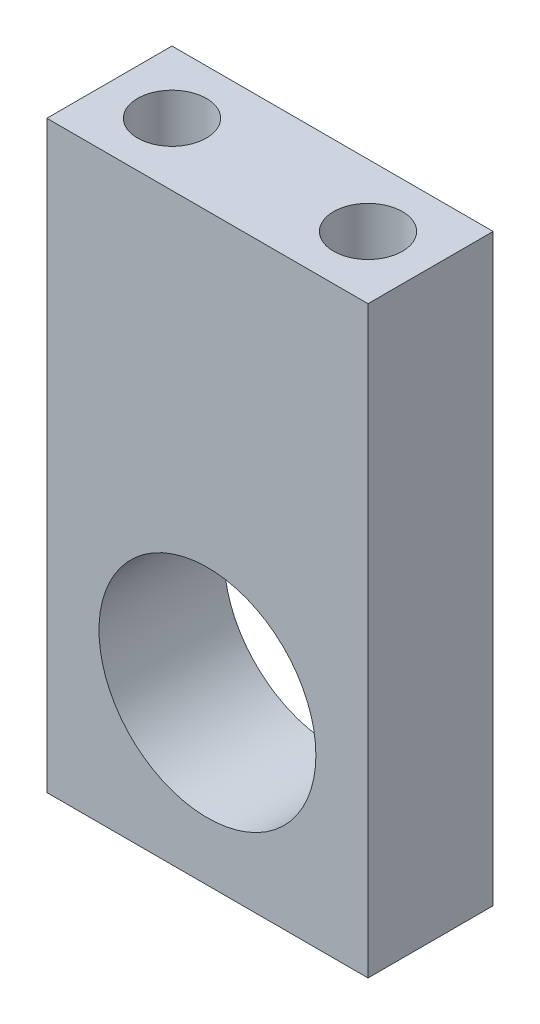
ISO-10303-21;
HEADER;
FILE_DESCRIPTION(('STEP AP214'),'2;1');
FILE_NAME('part.step','',(''),(''),'','','');
FILE_SCHEMA(('AUTOMOTIVE_DESIGN { 1 0 10303 214 1 1 1 1 }'));
ENDSEC;
DATA;
#1=APPLICATION_CONTEXT('core data for automotive mechanical design processes');
#2=APPLICATION_PROTOCOL_DEFINITION('international standard','automotive_design',2000,#1);
#3=PRODUCT_CONTEXT('',#1,'mechanical');
#4=PRODUCT('Part','Part','',(#3));
#5=PRODUCT_RELATED_PRODUCT_CATEGORY('part','',(#4));
#6=PRODUCT_DEFINITION_FORMATION('','',#4);
#7=PRODUCT_DEFINITION_CONTEXT('part definition',#1,'design');
#8=PRODUCT_DEFINITION('design','',#6,#7);
#9=PRODUCT_DEFINITION_SHAPE('','',#8);
#10=(LENGTH_UNIT() NAMED_UNIT(*) SI_UNIT(.MILLI.,.METRE.));
#11=(NAMED_UNIT(*) PLANE_ANGLE_UNIT() SI_UNIT($,.RADIAN.));
#12=(NAMED_UNIT(*) SI_UNIT($,.STERADIAN.) SOLID_ANGLE_UNIT());
#13=UNCERTAINTY_MEASURE_WITH_UNIT(LENGTH_MEASURE(1.E-05),#10,'distance_accuracy_value','');
#14=(GEOMETRIC_REPRESENTATION_CONTEXT(3) GLOBAL_UNCERTAINTY_ASSIGNED_CONTEXT((#13)) GLOBAL_UNIT_ASSIGNED_CONTEXT((#10,
#11,#12)) REPRESENTATION_CONTEXT('',''));
#15=CARTESIAN_POINT('',(0.,0.,0.));
#16=DIRECTION('',(0.,0.,1.));
#17=DIRECTION('',(1.,0.,0.));
#18=AXIS2_PLACEMENT_3D('',#15,#16,#17);
#19=CARTESIAN_POINT('',(7.7,28.,-3.));
#20=DIRECTION('',(-1.,0.,0.));
#21=DIRECTION('',(0.,0.,1.));
#22=AXIS2_PLACEMENT_3D('',#19,#20,#21);
#23=PLANE('',#22);
#24=DIRECTION('',(0.,0.,-1.));
#25=VECTOR('',#24,1.);
#26=CARTESIAN_POINT('',(7.7,0.,-3.));
#27=LINE('',#26,#25);
#28=CARTESIAN_POINT('',(7.7,0.,3.));
#29=VERTEX_POINT('',#28);
#30=CARTESIAN_POINT('',(7.7,0.,-3.));
#31=VERTEX_POINT('',#30);
#32=EDGE_CURVE('E109',#29,#31,#27,.T.);
#33=ORIENTED_EDGE('',*,*,#32,.T.);
#34=DIRECTION('',(0.,-1.,0.));
#35=VECTOR('',#34,1.);
#36=CARTESIAN_POINT('',(7.7,28.,-3.));
#37=LINE('',#36,#35);
#38=CARTESIAN_POINT('',(7.7,28.,-3.));
#39=VERTEX_POINT('',#38);
#40=EDGE_CURVE('E11',#39,#31,#37,.T.);
#41=ORIENTED_EDGE('',*,*,#40,.F.);
#42=DIRECTION('',(0.,0.,-1.));
#43=VECTOR('',#42,1.);
#44=CARTESIAN_POINT('',(7.7,28.,-3.));
#45=LINE('',#44,#43);
#46=CARTESIAN_POINT('',(7.7,28.,3.));
#47=VERTEX_POINT('',#46);
#48=EDGE_CURVE('E110',#47,#39,#45,.T.);
#49=ORIENTED_EDGE('',*,*,#48,.F.);
#50=DIRECTION('',(0.,-1.,0.));
#51=VECTOR('',#50,1.);
#52=CARTESIAN_POINT('',(7.7,28.,3.));
#53=LINE('',#52,#51);
#54=EDGE_CURVE('E116',#47,#29,#53,.T.);
#55=ORIENTED_EDGE('',*,*,#54,.T.);
#56=EDGE_LOOP('',(#33,#41,#49,#55));
#57=FACE_BOUND('',#56,.T.);
#58=ADVANCED_FACE('F32',(#57),#23,.F.);
#59=CARTESIAN_POINT('',(-7.7,28.,-3.));
#60=DIRECTION('',(0.,0.,1.));
#61=DIRECTION('',(1.,0.,0.));
#62=AXIS2_PLACEMENT_3D('',#59,#60,#61);
#63=PLANE('',#62);
#64=CARTESIAN_POINT('',(0.,8.,-3.));
#65=DIRECTION('',(0.,0.,1.));
#66=DIRECTION('',(1.,0.,0.));
#67=AXIS2_PLACEMENT_3D('',#64,#65,#66);
#68=CIRCLE('',#67,5.2);
#69=CARTESIAN_POINT('',(5.2,8.,-3.));
#70=VERTEX_POINT('',#69);
#71=EDGE_CURVE('E103',#70,#70,#68,.F.);
#72=ORIENTED_EDGE('',*,*,#71,.F.);
#73=EDGE_LOOP('',(#72));
#74=FACE_BOUND('',#73,.T.);
#75=DIRECTION('',(-1.,0.,0.));
#76=VECTOR('',#75,1.);
#77=CARTESIAN_POINT('',(-7.7,0.,-3.));
#78=LINE('',#77,#76);
#79=CARTESIAN_POINT('',(-7.7,0.,-3.));
#80=VERTEX_POINT('',#79);
#81=EDGE_CURVE('E119',#31,#80,#78,.T.);
#82=ORIENTED_EDGE('',*,*,#81,.T.);
#83=DIRECTION('',(0.,-1.,0.));
#84=VECTOR('',#83,1.);
#85=CARTESIAN_POINT('',(-7.7,28.,-3.));
#86=LINE('',#85,#84);
#87=CARTESIAN_POINT('',(-7.7,28.,-3.));
#88=VERTEX_POINT('',#87);
#89=EDGE_CURVE('E40',#88,#80,#86,.T.);
#90=ORIENTED_EDGE('',*,*,#89,.F.);
#91=DIRECTION('',(-1.,0.,0.));
#92=VECTOR('',#91,1.);
#93=CARTESIAN_POINT('',(-7.7,28.,-3.));
#94=LINE('',#93,#92);
#95=EDGE_CURVE('E79',#39,#88,#94,.T.);
#96=ORIENTED_EDGE('',*,*,#95,.F.);
#97=ORIENTED_EDGE('',*,*,#40,.T.);
#98=EDGE_LOOP('',(#82,#90,#96,#97));
#99=FACE_BOUND('',#98,.T.);
#100=ADVANCED_FACE('F144',(#74,#99),#63,.F.);
#101=CARTESIAN_POINT('',(-7.7,28.,-3.));
#102=DIRECTION('',(1.,0.,0.));
#103=DIRECTION('',(0.,0.,-1.));
#104=AXIS2_PLACEMENT_3D('',#101,#102,#103);
#105=PLANE('',#104);
#106=DIRECTION('',(0.,0.,1.));
#107=VECTOR('',#106,1.);
#108=CARTESIAN_POINT('',(-7.7,0.,-3.));
#109=LINE('',#108,#107);
#110=CARTESIAN_POINT('',(-7.7,0.,3.));
#111=VERTEX_POINT('',#110);
#112=EDGE_CURVE('E66',#80,#111,#109,.T.);
#113=ORIENTED_EDGE('',*,*,#112,.T.);
#114=DIRECTION('',(0.,-1.,0.));
#115=VECTOR('',#114,1.);
#116=CARTESIAN_POINT('',(-7.7,28.,3.));
#117=LINE('',#116,#115);
#118=CARTESIAN_POINT('',(-7.7,28.,3.));
#119=VERTEX_POINT('',#118);
#120=EDGE_CURVE('E124',#119,#111,#117,.T.);
#121=ORIENTED_EDGE('',*,*,#120,.F.);
#122=DIRECTION('',(0.,0.,1.));
#123=VECTOR('',#122,1.);
#124=CARTESIAN_POINT('',(-7.7,28.,-3.));
#125=LINE('',#124,#123);
#126=EDGE_CURVE('E113',#88,#119,#125,.T.);
#127=ORIENTED_EDGE('',*,*,#126,.F.);
#128=ORIENTED_EDGE('',*,*,#89,.T.);
#129=EDGE_LOOP('',(#113,#121,#127,#128));
#130=FACE_BOUND('',#129,.T.);
#131=ADVANCED_FACE('F126',(#130),#105,.F.);
#132=CARTESIAN_POINT('',(-7.7,28.,3.));
#133=DIRECTION('',(0.,0.,-1.));
#134=DIRECTION('',(-1.,0.,0.));
#135=AXIS2_PLACEMENT_3D('',#132,#133,#134);
#136=PLANE('',#135);
#137=CARTESIAN_POINT('',(0.,8.,3.));
#138=DIRECTION('',(0.,0.,1.));
#139=DIRECTION('',(1.,0.,0.));
#140=AXIS2_PLACEMENT_3D('',#137,#138,#139);
#141=CIRCLE('',#140,5.2);
#142=CARTESIAN_POINT('',(5.2,8.,3.));
#143=VERTEX_POINT('',#142);
#144=EDGE_CURVE('E158',#143,#143,#141,.T.);
#145=ORIENTED_EDGE('',*,*,#144,.F.);
#146=EDGE_LOOP('',(#145));
#147=FACE_BOUND('',#146,.T.);
#148=DIRECTION('',(1.,0.,0.));
#149=VECTOR('',#148,1.);
#150=CARTESIAN_POINT('',(-7.7,0.,3.));
#151=LINE('',#150,#149);
#152=EDGE_CURVE('E72',#111,#29,#151,.T.);
#153=ORIENTED_EDGE('',*,*,#152,.T.);
#154=ORIENTED_EDGE('',*,*,#54,.F.);
#155=DIRECTION('',(1.,0.,0.));
#156=VECTOR('',#155,1.);
#157=CARTESIAN_POINT('',(-7.7,28.,3.));
#158=LINE('',#157,#156);
#159=EDGE_CURVE('E48',#119,#47,#158,.T.);
#160=ORIENTED_EDGE('',*,*,#159,.F.);
#161=ORIENTED_EDGE('',*,*,#120,.T.);
#162=EDGE_LOOP('',(#153,#154,#160,#161));
#163=FACE_BOUND('',#162,.T.);
#164=ADVANCED_FACE('F133',(#147,#163),#136,.F.);
#165=CARTESIAN_POINT('',(0.,28.,0.));
#166=DIRECTION('',(0.,1.,0.));
#167=DIRECTION('',(0.,0.,1.));
#168=AXIS2_PLACEMENT_3D('',#165,#166,#167);
#169=PLANE('',#168);
#170=CARTESIAN_POINT('',(-4.7,28.,0.));
#171=DIRECTION('',(0.,1.,0.));
#172=DIRECTION('',(0.,0.,1.));
#173=AXIS2_PLACEMENT_3D('',#170,#171,#172);
#174=CIRCLE('',#173,1.64999999999999);
#175=CARTESIAN_POINT('',(-4.7,28.,1.64999999999999));
#176=VERTEX_POINT('',#175);
#177=EDGE_CURVE('E97',#176,#176,#174,.T.);
#178=ORIENTED_EDGE('',*,*,#177,.F.);
#179=EDGE_LOOP('',(#178));
#180=FACE_BOUND('',#179,.T.);
#181=CARTESIAN_POINT('',(4.7,28.,0.));
#182=DIRECTION('',(0.,1.,0.));
#183=DIRECTION('',(0.,0.,1.));
#184=AXIS2_PLACEMENT_3D('',#181,#182,#183);
#185=CIRCLE('',#184,1.64999999999999);
#186=CARTESIAN_POINT('',(4.7,28.,1.64999999999999));
#187=VERTEX_POINT('',#186);
#188=EDGE_CURVE('E96',#187,#187,#185,.T.);
#189=ORIENTED_EDGE('',*,*,#188,.F.);
#190=EDGE_LOOP('',(#189));
#191=FACE_BOUND('',#190,.T.);
#192=ORIENTED_EDGE('',*,*,#48,.T.);
#193=ORIENTED_EDGE('',*,*,#95,.T.);
#194=ORIENTED_EDGE('',*,*,#126,.T.);
#195=ORIENTED_EDGE('',*,*,#159,.T.);
#196=EDGE_LOOP('',(#192,#193,#194,#195));
#197=FACE_BOUND('',#196,.T.);
#198=ADVANCED_FACE('F135',(#180,#191,#197),#169,.T.);
#199=CARTESIAN_POINT('',(0.,0.,0.));
#200=DIRECTION('',(0.,1.,0.));
#201=DIRECTION('',(0.,0.,1.));
#202=AXIS2_PLACEMENT_3D('',#199,#200,#201);
#203=PLANE('',#202);
#204=ORIENTED_EDGE('',*,*,#32,.F.);
#205=ORIENTED_EDGE('',*,*,#152,.F.);
#206=ORIENTED_EDGE('',*,*,#112,.F.);
#207=ORIENTED_EDGE('',*,*,#81,.F.);
#208=EDGE_LOOP('',(#204,#205,#206,#207));
#209=FACE_BOUND('',#208,.T.);
#210=ADVANCED_FACE('F129',(#209),#203,.F.);
#211=CARTESIAN_POINT('',(4.7,14.6,0.));
#212=DIRECTION('',(0.,1.,0.));
#213=DIRECTION('',(0.,0.,1.));
#214=AXIS2_PLACEMENT_3D('',#211,#212,#213);
#215=CONICAL_SURFACE('',#214,1.65,1.02974425867665);
#216=CARTESIAN_POINT('',(4.7,13.6085799786045,0.));
#217=VERTEX_POINT('',#216);
#218=VERTEX_LOOP('',#217);
#219=FACE_BOUND('',#218,.T.);
#220=CARTESIAN_POINT('',(4.7,14.6,0.));
#221=DIRECTION('',(0.,1.,0.));
#222=DIRECTION('',(0.,0.,1.));
#223=AXIS2_PLACEMENT_3D('',#220,#221,#222);
#224=CIRCLE('',#223,1.65);
#225=CARTESIAN_POINT('',(4.7,14.6,1.65));
#226=VERTEX_POINT('',#225);
#227=EDGE_CURVE('E100',#226,#226,#224,.T.);
#228=ORIENTED_EDGE('',*,*,#227,.T.);
#229=EDGE_LOOP('',(#228));
#230=FACE_BOUND('',#229,.T.);
#231=ADVANCED_FACE('F172',(#219,#230),#215,.F.);
#232=CARTESIAN_POINT('',(4.7,28.,0.));
#233=DIRECTION('',(0.,1.,0.));
#234=DIRECTION('',(0.,0.,1.));
#235=AXIS2_PLACEMENT_3D('',#232,#233,#234);
#236=CYLINDRICAL_SURFACE('',#235,1.64999999999999);
#237=ORIENTED_EDGE('',*,*,#227,.F.);
#238=EDGE_LOOP('',(#237));
#239=FACE_BOUND('',#238,.T.);
#240=ORIENTED_EDGE('',*,*,#188,.T.);
#241=EDGE_LOOP('',(#240));
#242=FACE_BOUND('',#241,.T.);
#243=ADVANCED_FACE('F90',(#239,#242),#236,.F.);
#244=CARTESIAN_POINT('',(-4.7,14.6,0.));
#245=DIRECTION('',(0.,1.,0.));
#246=DIRECTION('',(0.,0.,1.));
#247=AXIS2_PLACEMENT_3D('',#244,#245,#246);
#248=CONICAL_SURFACE('',#247,1.64999999999999,1.02974425867665);
#249=CARTESIAN_POINT('',(-4.7,13.6085799786045,0.));
#250=VERTEX_POINT('',#249);
#251=VERTEX_LOOP('',#250);
#252=FACE_BOUND('',#251,.T.);
#253=CARTESIAN_POINT('',(-4.7,14.6,0.));
#254=DIRECTION('',(0.,1.,0.));
#255=DIRECTION('',(0.,0.,1.));
#256=AXIS2_PLACEMENT_3D('',#253,#254,#255);
#257=CIRCLE('',#256,1.64999999999999);
#258=CARTESIAN_POINT('',(-4.7,14.6,1.65));
#259=VERTEX_POINT('',#258);
#260=EDGE_CURVE('E94',#259,#259,#257,.T.);
#261=ORIENTED_EDGE('',*,*,#260,.T.);
#262=EDGE_LOOP('',(#261));
#263=FACE_BOUND('',#262,.T.);
#264=ADVANCED_FACE('F86',(#252,#263),#248,.F.);
#265=CARTESIAN_POINT('',(-4.7,28.,0.));
#266=DIRECTION('',(0.,1.,0.));
#267=DIRECTION('',(0.,0.,1.));
#268=AXIS2_PLACEMENT_3D('',#265,#266,#267);
#269=CYLINDRICAL_SURFACE('',#268,1.64999999999999);
#270=ORIENTED_EDGE('',*,*,#260,.F.);
#271=EDGE_LOOP('',(#270));
#272=FACE_BOUND('',#271,.T.);
#273=ORIENTED_EDGE('',*,*,#177,.T.);
#274=EDGE_LOOP('',(#273));
#275=FACE_BOUND('',#274,.T.);
#276=ADVANCED_FACE('F89',(#272,#275),#269,.F.);
#277=CARTESIAN_POINT('',(0.,8.,-3.001));
#278=DIRECTION('',(0.,0.,1.));
#279=DIRECTION('',(1.,0.,0.));
#280=AXIS2_PLACEMENT_3D('',#277,#278,#279);
#281=CYLINDRICAL_SURFACE('',#280,5.2);
#282=CARTESIAN_POINT('',(5.2,8.,3.));
#283=CARTESIAN_POINT('',(5.2,8.,2.9375));
#284=CARTESIAN_POINT('',(5.2,8.,2.875));
#285=CARTESIAN_POINT('',(5.2,8.,2.75));
#286=CARTESIAN_POINT('',(5.2,8.,2.6875));
#287=CARTESIAN_POINT('',(5.2,8.,2.5625));
#288=CARTESIAN_POINT('',(5.2,8.,2.5));
#289=CARTESIAN_POINT('',(5.2,8.,2.375));
#290=CARTESIAN_POINT('',(5.2,8.,2.3125));
#291=CARTESIAN_POINT('',(5.2,8.,2.1875));
#292=CARTESIAN_POINT('',(5.2,8.,2.125));
#293=CARTESIAN_POINT('',(5.2,8.,2.));
#294=CARTESIAN_POINT('',(5.2,8.,1.9375));
#295=CARTESIAN_POINT('',(5.2,8.,1.8125));
#296=CARTESIAN_POINT('',(5.2,8.,1.75));
#297=CARTESIAN_POINT('',(5.2,8.,1.625));
#298=CARTESIAN_POINT('',(5.2,8.,1.5625));
#299=CARTESIAN_POINT('',(5.2,8.,1.4375));
#300=CARTESIAN_POINT('',(5.2,8.,1.375));
#301=CARTESIAN_POINT('',(5.2,8.,1.25));
#302=CARTESIAN_POINT('',(5.2,8.,1.1875));
#303=CARTESIAN_POINT('',(5.2,8.,1.0625));
#304=CARTESIAN_POINT('',(5.2,8.,1.));
#305=CARTESIAN_POINT('',(5.2,8.,0.875));
#306=CARTESIAN_POINT('',(5.2,8.,0.8125));
#307=CARTESIAN_POINT('',(5.2,8.,0.6875));
#308=CARTESIAN_POINT('',(5.2,8.,0.625));
#309=CARTESIAN_POINT('',(5.2,8.,0.5));
#310=CARTESIAN_POINT('',(5.2,8.,0.4375));
#311=CARTESIAN_POINT('',(5.2,8.,0.3125));
#312=CARTESIAN_POINT('',(5.2,8.,0.25));
#313=CARTESIAN_POINT('',(5.2,8.,0.125));
#314=CARTESIAN_POINT('',(5.2,8.,0.0624999999999996));
#315=CARTESIAN_POINT('',(5.2,8.,-0.0625000000000005));
#316=CARTESIAN_POINT('',(5.2,8.,-0.125000000000001));
#317=CARTESIAN_POINT('',(5.2,8.,-0.250000000000001));
#318=CARTESIAN_POINT('',(5.2,8.,-0.3125));
#319=CARTESIAN_POINT('',(5.2,8.,-0.4375));
#320=CARTESIAN_POINT('',(5.2,8.,-0.5));
#321=CARTESIAN_POINT('',(5.2,8.,-0.625000000000001));
#322=CARTESIAN_POINT('',(5.2,8.,-0.687500000000001));
#323=CARTESIAN_POINT('',(5.2,8.,-0.812500000000001));
#324=CARTESIAN_POINT('',(5.2,8.,-0.875000000000001));
#325=CARTESIAN_POINT('',(5.2,8.,-1.));
#326=CARTESIAN_POINT('',(5.2,8.,-1.0625));
#327=CARTESIAN_POINT('',(5.2,8.,-1.1875));
#328=CARTESIAN_POINT('',(5.2,8.,-1.25));
#329=CARTESIAN_POINT('',(5.2,8.,-1.375));
#330=CARTESIAN_POINT('',(5.2,8.,-1.4375));
#331=CARTESIAN_POINT('',(5.2,8.,-1.5625));
#332=CARTESIAN_POINT('',(5.2,8.,-1.625));
#333=CARTESIAN_POINT('',(5.2,8.,-1.75));
#334=CARTESIAN_POINT('',(5.2,8.,-1.8125));
#335=CARTESIAN_POINT('',(5.2,8.,-1.9375));
#336=CARTESIAN_POINT('',(5.2,8.,-2.));
#337=CARTESIAN_POINT('',(5.2,8.,-2.125));
#338=CARTESIAN_POINT('',(5.2,8.,-2.1875));
#339=CARTESIAN_POINT('',(5.2,8.,-2.3125));
#340=CARTESIAN_POINT('',(5.2,8.,-2.375));
#341=CARTESIAN_POINT('',(5.2,8.,-2.5));
#342=CARTESIAN_POINT('',(5.2,8.,-2.5625));
#343=CARTESIAN_POINT('',(5.2,8.,-2.6875));
#344=CARTESIAN_POINT('',(5.2,8.,-2.75));
#345=CARTESIAN_POINT('',(5.2,8.,-2.875));
#346=CARTESIAN_POINT('',(5.2,8.,-2.9375));
#347=CARTESIAN_POINT('',(5.2,8.,-3.));
#348=B_SPLINE_CURVE_WITH_KNOTS('',3,(#282,#283,#284,#285,#286,#287,#288,#289,#290,#291,#292,
#293,#294,#295,#296,#297,#298,#299,#300,#301,#302,#303,#304,#305,#306,#307,#308,#309,#310,#311,
#312,#313,#314,#315,#316,#317,#318,#319,#320,#321,#322,#323,#324,#325,#326,#327,#328,#329,#330,
#331,#332,#333,#334,#335,#336,#337,#338,#339,#340,#341,#342,#343,#344,#345,#346,#347),
.UNSPECIFIED.,.F.,.F.,(4,2,2,2,2,2,2,2,2,2,2,2,2,2,2,2,2,2,2,2,2,2,2,2,2,2,2,2,2,2,2,2,4),(0.,
0.1875,0.375,0.5625,0.75,0.9375,1.125,1.3125,1.5,1.6875,1.875,2.0625,2.25,2.4375,2.625,2.8125,
3.,3.1875,3.375,3.5625,3.75,3.9375,4.125,4.3125,4.5,4.6875,4.875,5.0625,5.25,5.4375,5.625,
5.8125,6.),.UNSPECIFIED.);
#349=EDGE_CURVE('BSEAM162',#143,#70,#348,.T.);
#350=ORIENTED_EDGE('',*,*,#144,.T.);
#351=ORIENTED_EDGE('',*,*,#71,.T.);
#352=ORIENTED_EDGE('',*,*,#349,.T.);
#353=ORIENTED_EDGE('',*,*,#349,.F.);
#354=EDGE_LOOP('',(#350,#352,#351,#353));
#355=FACE_BOUND('',#354,.T.);
#356=ADVANCED_FACE('F162',(#355),#281,.F.);
#357=CLOSED_SHELL('',(#58,#100,#131,#164,#198,#210,#231,#243,#264,#276,#356));
#358=MANIFOLD_SOLID_BREP('B2',#357);
#359=ADVANCED_BREP_SHAPE_REPRESENTATION('',(#18,#358),#14);
#360=SHAPE_DEFINITION_REPRESENTATION(#9,#359);
ENDSEC;
END-ISO-10303-21;
